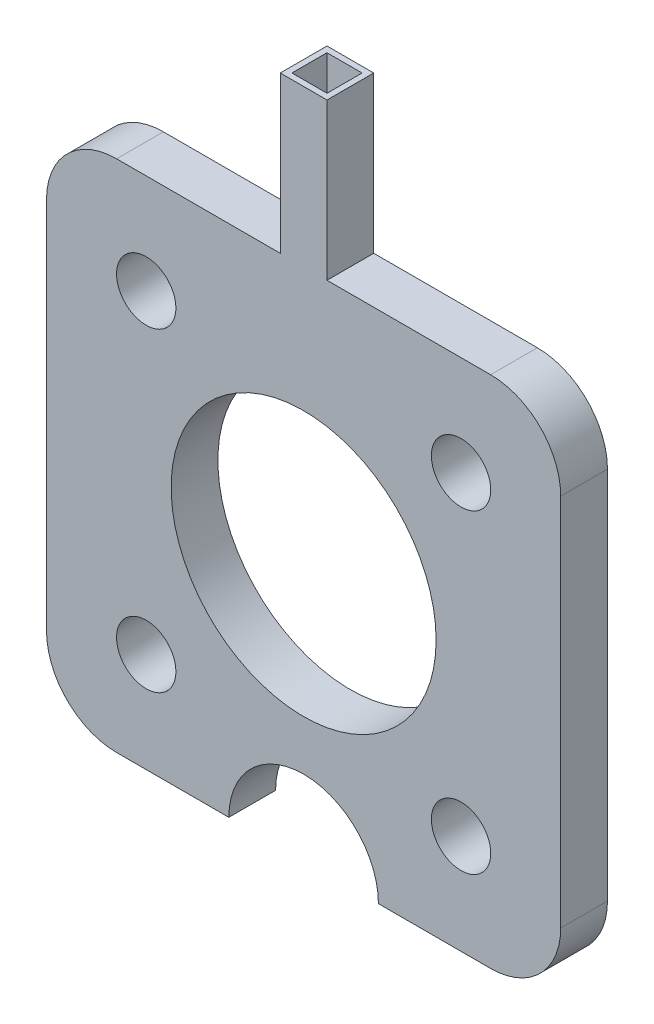
ISO-10303-21;
HEADER;
FILE_DESCRIPTION(('STEP AP214'),'2;1');
FILE_NAME('part.step','',(''),(''),'','','');
FILE_SCHEMA(('AUTOMOTIVE_DESIGN { 1 0 10303 214 1 1 1 1 }'));
ENDSEC;
DATA;
#1=APPLICATION_CONTEXT('core data for automotive mechanical design processes');
#2=APPLICATION_PROTOCOL_DEFINITION('international standard','automotive_design',2000,#1);
#3=PRODUCT_CONTEXT('',#1,'mechanical');
#4=PRODUCT('Part','Part','',(#3));
#5=PRODUCT_RELATED_PRODUCT_CATEGORY('part','',(#4));
#6=PRODUCT_DEFINITION_FORMATION('','',#4);
#7=PRODUCT_DEFINITION_CONTEXT('part definition',#1,'design');
#8=PRODUCT_DEFINITION('design','',#6,#7);
#9=PRODUCT_DEFINITION_SHAPE('','',#8);
#10=(LENGTH_UNIT() NAMED_UNIT(*) SI_UNIT(.MILLI.,.METRE.));
#11=(NAMED_UNIT(*) PLANE_ANGLE_UNIT() SI_UNIT($,.RADIAN.));
#12=(NAMED_UNIT(*) SI_UNIT($,.STERADIAN.) SOLID_ANGLE_UNIT());
#13=UNCERTAINTY_MEASURE_WITH_UNIT(LENGTH_MEASURE(1.E-05),#10,'distance_accuracy_value','');
#14=(GEOMETRIC_REPRESENTATION_CONTEXT(3) GLOBAL_UNCERTAINTY_ASSIGNED_CONTEXT((#13)) GLOBAL_UNIT_ASSIGNED_CONTEXT((#10,
#11,#12)) REPRESENTATION_CONTEXT('',''));
#15=CARTESIAN_POINT('',(0.,0.,0.));
#16=DIRECTION('',(0.,0.,1.));
#17=DIRECTION('',(1.,0.,0.));
#18=AXIS2_PLACEMENT_3D('',#15,#16,#17);
#19=CARTESIAN_POINT('',(0.,0.,2.));
#20=DIRECTION('',(0.,-1.,0.));
#21=DIRECTION('',(0.,0.,-1.));
#22=AXIS2_PLACEMENT_3D('',#19,#20,#21);
#23=PLANE('',#22);
#24=DIRECTION('',(0.,0.,-1.));
#25=VECTOR('',#24,1.);
#26=CARTESIAN_POINT('',(12.,0.,0.));
#27=LINE('',#26,#25);
#28=CARTESIAN_POINT('',(12.,0.,2.));
#29=VERTEX_POINT('',#28);
#30=CARTESIAN_POINT('',(12.,0.,0.));
#31=VERTEX_POINT('',#30);
#32=EDGE_CURVE('E215',#29,#31,#27,.T.);
#33=ORIENTED_EDGE('',*,*,#32,.F.);
#34=DIRECTION('',(-1.,0.,0.));
#35=VECTOR('',#34,1.);
#36=CARTESIAN_POINT('',(0.,0.,2.));
#37=LINE('',#36,#35);
#38=CARTESIAN_POINT('',(19.,0.,2.));
#39=VERTEX_POINT('',#38);
#40=EDGE_CURVE('E321',#39,#29,#37,.T.);
#41=ORIENTED_EDGE('',*,*,#40,.F.);
#42=DIRECTION('',(0.,0.,-1.));
#43=VECTOR('',#42,1.);
#44=CARTESIAN_POINT('',(19.,0.,2.));
#45=LINE('',#44,#43);
#46=CARTESIAN_POINT('',(19.,0.,0.));
#47=VERTEX_POINT('',#46);
#48=EDGE_CURVE('E53',#39,#47,#45,.T.);
#49=ORIENTED_EDGE('',*,*,#48,.T.);
#50=DIRECTION('',(-1.,0.,0.));
#51=VECTOR('',#50,1.);
#52=CARTESIAN_POINT('',(0.,0.,0.));
#53=LINE('',#52,#51);
#54=EDGE_CURVE('E312',#47,#31,#53,.T.);
#55=ORIENTED_EDGE('',*,*,#54,.T.);
#56=EDGE_LOOP('',(#33,#41,#49,#55));
#57=FACE_BOUND('',#56,.T.);
#58=ADVANCED_FACE('F43',(#57),#23,.F.);
#59=DIRECTION('',(0.,0.,1.));
#60=VECTOR('',#59,1.);
#61=CARTESIAN_POINT('',(10.,0.,0.));
#62=LINE('',#61,#60);
#63=CARTESIAN_POINT('',(10.,0.,0.));
#64=VERTEX_POINT('',#63);
#65=CARTESIAN_POINT('',(10.,0.,2.));
#66=VERTEX_POINT('',#65);
#67=EDGE_CURVE('E226',#64,#66,#62,.T.);
#68=ORIENTED_EDGE('',*,*,#67,.F.);
#69=CARTESIAN_POINT('',(3.,0.,0.));
#70=VERTEX_POINT('',#69);
#71=EDGE_CURVE('E338',#64,#70,#53,.T.);
#72=ORIENTED_EDGE('',*,*,#71,.T.);
#73=DIRECTION('',(0.,0.,-1.));
#74=VECTOR('',#73,1.);
#75=CARTESIAN_POINT('',(3.,0.,2.));
#76=LINE('',#75,#74);
#77=CARTESIAN_POINT('',(3.,0.,2.));
#78=VERTEX_POINT('',#77);
#79=EDGE_CURVE('E11',#70,#78,#76,.F.);
#80=ORIENTED_EDGE('',*,*,#79,.T.);
#81=EDGE_CURVE('E67',#66,#78,#37,.T.);
#82=ORIENTED_EDGE('',*,*,#81,.F.);
#83=EDGE_LOOP('',(#68,#72,#80,#82));
#84=FACE_BOUND('',#83,.T.);
#85=ADVANCED_FACE('F447',(#84),#23,.F.);
#86=CARTESIAN_POINT('',(0.,-22.,2.));
#87=DIRECTION('',(0.,1.,0.));
#88=DIRECTION('',(0.,0.,1.));
#89=AXIS2_PLACEMENT_3D('',#86,#87,#88);
#90=PLANE('',#89);
#91=DIRECTION('',(1.,0.,0.));
#92=VECTOR('',#91,1.);
#93=CARTESIAN_POINT('',(0.,-22.,0.));
#94=LINE('',#93,#92);
#95=CARTESIAN_POINT('',(3.,-22.,0.));
#96=VERTEX_POINT('',#95);
#97=CARTESIAN_POINT('',(7.8,-22.,0.));
#98=VERTEX_POINT('',#97);
#99=EDGE_CURVE('E330',#96,#98,#94,.T.);
#100=ORIENTED_EDGE('',*,*,#99,.T.);
#101=DIRECTION('',(0.,0.,1.));
#102=VECTOR('',#101,1.);
#103=CARTESIAN_POINT('',(7.8,-22.,0.));
#104=LINE('',#103,#102);
#105=CARTESIAN_POINT('',(7.8,-22.,2.));
#106=VERTEX_POINT('',#105);
#107=EDGE_CURVE('E264',#98,#106,#104,.T.);
#108=ORIENTED_EDGE('',*,*,#107,.T.);
#109=DIRECTION('',(1.,0.,0.));
#110=VECTOR('',#109,1.);
#111=CARTESIAN_POINT('',(0.,-22.,2.));
#112=LINE('',#111,#110);
#113=CARTESIAN_POINT('',(3.,-22.,2.));
#114=VERTEX_POINT('',#113);
#115=EDGE_CURVE('E313',#114,#106,#112,.T.);
#116=ORIENTED_EDGE('',*,*,#115,.F.);
#117=DIRECTION('',(0.,0.,-1.));
#118=VECTOR('',#117,1.);
#119=CARTESIAN_POINT('',(3.,-22.,2.));
#120=LINE('',#119,#118);
#121=EDGE_CURVE('E361',#114,#96,#120,.T.);
#122=ORIENTED_EDGE('',*,*,#121,.T.);
#123=EDGE_LOOP('',(#100,#108,#116,#122));
#124=FACE_BOUND('',#123,.T.);
#125=ADVANCED_FACE('F452',(#124),#90,.F.);
#126=CARTESIAN_POINT('',(0.,0.,2.));
#127=DIRECTION('',(1.,0.,0.));
#128=DIRECTION('',(0.,1.,0.));
#129=AXIS2_PLACEMENT_3D('',#126,#127,#128);
#130=PLANE('',#129);
#131=DIRECTION('',(0.,-1.,0.));
#132=VECTOR('',#131,1.);
#133=CARTESIAN_POINT('',(0.,0.,0.));
#134=LINE('',#133,#132);
#135=CARTESIAN_POINT('',(0.,-3.,0.));
#136=VERTEX_POINT('',#135);
#137=CARTESIAN_POINT('',(0.,-19.,0.));
#138=VERTEX_POINT('',#137);
#139=EDGE_CURVE('E303',#136,#138,#134,.T.);
#140=ORIENTED_EDGE('',*,*,#139,.T.);
#141=DIRECTION('',(0.,0.,-1.));
#142=VECTOR('',#141,1.);
#143=CARTESIAN_POINT('',(0.,-19.,2.));
#144=LINE('',#143,#142);
#145=CARTESIAN_POINT('',(0.,-19.,2.));
#146=VERTEX_POINT('',#145);
#147=EDGE_CURVE('E385',#138,#146,#144,.F.);
#148=ORIENTED_EDGE('',*,*,#147,.T.);
#149=DIRECTION('',(0.,-1.,0.));
#150=VECTOR('',#149,1.);
#151=CARTESIAN_POINT('',(0.,0.,2.));
#152=LINE('',#151,#150);
#153=CARTESIAN_POINT('',(0.,-3.,2.));
#154=VERTEX_POINT('',#153);
#155=EDGE_CURVE('E307',#154,#146,#152,.T.);
#156=ORIENTED_EDGE('',*,*,#155,.F.);
#157=DIRECTION('',(0.,0.,-1.));
#158=VECTOR('',#157,1.);
#159=CARTESIAN_POINT('',(0.,-3.,2.));
#160=LINE('',#159,#158);
#161=EDGE_CURVE('E381',#154,#136,#160,.T.);
#162=ORIENTED_EDGE('',*,*,#161,.T.);
#163=EDGE_LOOP('',(#140,#148,#156,#162));
#164=FACE_BOUND('',#163,.T.);
#165=ADVANCED_FACE('F460',(#164),#130,.F.);
#166=CARTESIAN_POINT('',(14.2,-22.,2.));
#167=VERTEX_POINT('',#166);
#168=CARTESIAN_POINT('',(19.,-22.,2.));
#169=VERTEX_POINT('',#168);
#170=EDGE_CURVE('E311',#167,#169,#112,.T.);
#171=ORIENTED_EDGE('',*,*,#170,.F.);
#172=DIRECTION('',(0.,0.,1.));
#173=VECTOR('',#172,1.);
#174=CARTESIAN_POINT('',(14.2,-22.,0.));
#175=LINE('',#174,#173);
#176=CARTESIAN_POINT('',(14.2,-22.,0.));
#177=VERTEX_POINT('',#176);
#178=EDGE_CURVE('E268',#177,#167,#175,.T.);
#179=ORIENTED_EDGE('',*,*,#178,.F.);
#180=CARTESIAN_POINT('',(19.,-22.,0.));
#181=VERTEX_POINT('',#180);
#182=EDGE_CURVE('E329',#177,#181,#94,.T.);
#183=ORIENTED_EDGE('',*,*,#182,.T.);
#184=DIRECTION('',(0.,0.,-1.));
#185=VECTOR('',#184,1.);
#186=CARTESIAN_POINT('',(19.,-22.,2.));
#187=LINE('',#186,#185);
#188=EDGE_CURVE('E365',#181,#169,#187,.F.);
#189=ORIENTED_EDGE('',*,*,#188,.T.);
#190=EDGE_LOOP('',(#171,#179,#183,#189));
#191=FACE_BOUND('',#190,.T.);
#192=ADVANCED_FACE('F422',(#191),#90,.F.);
#193=CARTESIAN_POINT('',(22.,0.,2.));
#194=DIRECTION('',(-1.,0.,0.));
#195=DIRECTION('',(0.,-1.,0.));
#196=AXIS2_PLACEMENT_3D('',#193,#194,#195);
#197=PLANE('',#196);
#198=DIRECTION('',(0.,1.,0.));
#199=VECTOR('',#198,1.);
#200=CARTESIAN_POINT('',(22.,0.,2.));
#201=LINE('',#200,#199);
#202=CARTESIAN_POINT('',(22.,-19.,2.));
#203=VERTEX_POINT('',#202);
#204=CARTESIAN_POINT('',(22.,-3.,2.));
#205=VERTEX_POINT('',#204);
#206=EDGE_CURVE('E317',#203,#205,#201,.T.);
#207=ORIENTED_EDGE('',*,*,#206,.F.);
#208=DIRECTION('',(0.,0.,-1.));
#209=VECTOR('',#208,1.);
#210=CARTESIAN_POINT('',(22.,-19.,2.));
#211=LINE('',#210,#209);
#212=CARTESIAN_POINT('',(22.,-19.,0.));
#213=VERTEX_POINT('',#212);
#214=EDGE_CURVE('E343',#203,#213,#211,.T.);
#215=ORIENTED_EDGE('',*,*,#214,.T.);
#216=DIRECTION('',(0.,1.,0.));
#217=VECTOR('',#216,1.);
#218=CARTESIAN_POINT('',(22.,0.,0.));
#219=LINE('',#218,#217);
#220=CARTESIAN_POINT('',(22.,-3.,0.));
#221=VERTEX_POINT('',#220);
#222=EDGE_CURVE('E334',#213,#221,#219,.T.);
#223=ORIENTED_EDGE('',*,*,#222,.T.);
#224=DIRECTION('',(0.,0.,-1.));
#225=VECTOR('',#224,1.);
#226=CARTESIAN_POINT('',(22.,-3.,2.));
#227=LINE('',#226,#225);
#228=EDGE_CURVE('E325',#221,#205,#227,.F.);
#229=ORIENTED_EDGE('',*,*,#228,.T.);
#230=EDGE_LOOP('',(#207,#215,#223,#229));
#231=FACE_BOUND('',#230,.T.);
#232=ADVANCED_FACE('F414',(#231),#197,.F.);
#233=CARTESIAN_POINT('',(0.,0.,2.));
#234=DIRECTION('',(0.,0.,1.));
#235=DIRECTION('',(1.,0.,0.));
#236=AXIS2_PLACEMENT_3D('',#233,#234,#235);
#237=PLANE('',#236);
#238=CARTESIAN_POINT('',(11.,-11.,2.));
#239=DIRECTION('',(0.,0.,1.));
#240=DIRECTION('',(1.,0.,0.));
#241=AXIS2_PLACEMENT_3D('',#238,#239,#240);
#242=CIRCLE('',#241,5.66890012969368);
#243=CARTESIAN_POINT('',(16.6689001296937,-11.,2.));
#244=VERTEX_POINT('',#243);
#245=EDGE_CURVE('E256',#244,#244,#242,.T.);
#246=ORIENTED_EDGE('',*,*,#245,.F.);
#247=EDGE_LOOP('',(#246));
#248=FACE_BOUND('',#247,.T.);
#249=CARTESIAN_POINT('',(11.,-22.,2.));
#250=DIRECTION('',(0.,0.,1.));
#251=DIRECTION('',(-1.,0.,0.));
#252=AXIS2_PLACEMENT_3D('',#249,#250,#251);
#253=CIRCLE('',#252,3.2);
#254=EDGE_CURVE('E265',#167,#106,#253,.T.);
#255=ORIENTED_EDGE('',*,*,#254,.F.);
#256=ORIENTED_EDGE('',*,*,#170,.T.);
#257=CARTESIAN_POINT('',(19.,-19.,2.));
#258=DIRECTION('',(0.,0.,1.));
#259=DIRECTION('',(1.,0.,0.));
#260=AXIS2_PLACEMENT_3D('',#257,#258,#259);
#261=CIRCLE('',#260,3.);
#262=EDGE_CURVE('E378',#169,#203,#261,.T.);
#263=ORIENTED_EDGE('',*,*,#262,.T.);
#264=ORIENTED_EDGE('',*,*,#206,.T.);
#265=CARTESIAN_POINT('',(19.,-3.,2.));
#266=DIRECTION('',(0.,0.,1.));
#267=DIRECTION('',(1.,0.,0.));
#268=AXIS2_PLACEMENT_3D('',#265,#266,#267);
#269=CIRCLE('',#268,3.);
#270=EDGE_CURVE('E369',#205,#39,#269,.T.);
#271=ORIENTED_EDGE('',*,*,#270,.T.);
#272=ORIENTED_EDGE('',*,*,#40,.T.);
#273=DIRECTION('',(0.,-1.,0.));
#274=VECTOR('',#273,1.);
#275=CARTESIAN_POINT('',(12.,6.68,2.));
#276=LINE('',#275,#274);
#277=CARTESIAN_POINT('',(12.,6.68,2.));
#278=VERTEX_POINT('',#277);
#279=EDGE_CURVE('E235',#278,#29,#276,.T.);
#280=ORIENTED_EDGE('',*,*,#279,.F.);
#281=DIRECTION('',(1.,0.,0.));
#282=VECTOR('',#281,1.);
#283=CARTESIAN_POINT('',(10.,6.68,2.));
#284=LINE('',#283,#282);
#285=CARTESIAN_POINT('',(10.,6.68,2.));
#286=VERTEX_POINT('',#285);
#287=EDGE_CURVE('E232',#286,#278,#284,.T.);
#288=ORIENTED_EDGE('',*,*,#287,.F.);
#289=DIRECTION('',(0.,-1.,0.));
#290=VECTOR('',#289,1.);
#291=CARTESIAN_POINT('',(10.,6.68,2.));
#292=LINE('',#291,#290);
#293=EDGE_CURVE('E244',#286,#66,#292,.T.);
#294=ORIENTED_EDGE('',*,*,#293,.T.);
#295=ORIENTED_EDGE('',*,*,#81,.T.);
#296=CARTESIAN_POINT('',(3.,-3.,2.));
#297=DIRECTION('',(0.,0.,1.));
#298=DIRECTION('',(1.,0.,0.));
#299=AXIS2_PLACEMENT_3D('',#296,#297,#298);
#300=CIRCLE('',#299,3.);
#301=EDGE_CURVE('E372',#78,#154,#300,.T.);
#302=ORIENTED_EDGE('',*,*,#301,.T.);
#303=ORIENTED_EDGE('',*,*,#155,.T.);
#304=CARTESIAN_POINT('',(3.,-19.,2.));
#305=DIRECTION('',(0.,0.,1.));
#306=DIRECTION('',(1.,0.,0.));
#307=AXIS2_PLACEMENT_3D('',#304,#305,#306);
#308=CIRCLE('',#307,3.);
#309=EDGE_CURVE('E375',#146,#114,#308,.T.);
#310=ORIENTED_EDGE('',*,*,#309,.T.);
#311=ORIENTED_EDGE('',*,*,#115,.T.);
#312=EDGE_LOOP('',(#255,#256,#263,#264,#271,#272,#280,#288,#294,#295,#302,#303,#310,#311));
#313=FACE_BOUND('',#312,.T.);
#314=CARTESIAN_POINT('',(4.265,-17.735,2.));
#315=DIRECTION('',(0.,0.,1.));
#316=DIRECTION('',(1.,0.,0.));
#317=AXIS2_PLACEMENT_3D('',#314,#315,#316);
#318=CIRCLE('',#317,1.27);
#319=CARTESIAN_POINT('',(5.535,-17.735,2.));
#320=VERTEX_POINT('',#319);
#321=EDGE_CURVE('E283',#320,#320,#318,.T.);
#322=ORIENTED_EDGE('',*,*,#321,.F.);
#323=EDGE_LOOP('',(#322));
#324=FACE_BOUND('',#323,.T.);
#325=CARTESIAN_POINT('',(17.735,-4.265,2.));
#326=DIRECTION('',(0.,0.,1.));
#327=DIRECTION('',(1.,0.,0.));
#328=AXIS2_PLACEMENT_3D('',#325,#326,#327);
#329=CIRCLE('',#328,1.27);
#330=CARTESIAN_POINT('',(19.005,-4.265,2.));
#331=VERTEX_POINT('',#330);
#332=EDGE_CURVE('E292',#331,#331,#329,.T.);
#333=ORIENTED_EDGE('',*,*,#332,.F.);
#334=EDGE_LOOP('',(#333));
#335=FACE_BOUND('',#334,.T.);
#336=CARTESIAN_POINT('',(17.735,-17.735,2.));
#337=DIRECTION('',(0.,0.,1.));
#338=DIRECTION('',(1.,0.,0.));
#339=AXIS2_PLACEMENT_3D('',#336,#337,#338);
#340=CIRCLE('',#339,1.27);
#341=CARTESIAN_POINT('',(19.005,-17.735,2.));
#342=VERTEX_POINT('',#341);
#343=EDGE_CURVE('E275',#342,#342,#340,.T.);
#344=ORIENTED_EDGE('',*,*,#343,.F.);
#345=EDGE_LOOP('',(#344));
#346=FACE_BOUND('',#345,.T.);
#347=CARTESIAN_POINT('',(4.265,-4.265,2.));
#348=DIRECTION('',(0.,0.,1.));
#349=DIRECTION('',(1.,0.,0.));
#350=AXIS2_PLACEMENT_3D('',#347,#348,#349);
#351=CIRCLE('',#350,1.27);
#352=CARTESIAN_POINT('',(5.535,-4.265,2.));
#353=VERTEX_POINT('',#352);
#354=EDGE_CURVE('E287',#353,#353,#351,.T.);
#355=ORIENTED_EDGE('',*,*,#354,.F.);
#356=EDGE_LOOP('',(#355));
#357=FACE_BOUND('',#356,.T.);
#358=ADVANCED_FACE('F408',(#248,#313,#324,#335,#346,#357),#237,.T.);
#359=CARTESIAN_POINT('',(0.,0.,0.));
#360=DIRECTION('',(0.,0.,1.));
#361=DIRECTION('',(1.,0.,0.));
#362=AXIS2_PLACEMENT_3D('',#359,#360,#361);
#363=PLANE('',#362);
#364=CARTESIAN_POINT('',(11.,-11.,0.));
#365=DIRECTION('',(0.,0.,1.));
#366=DIRECTION('',(1.,0.,0.));
#367=AXIS2_PLACEMENT_3D('',#364,#365,#366);
#368=CIRCLE('',#367,5.66890012969368);
#369=CARTESIAN_POINT('',(16.6689001296937,-11.,0.));
#370=VERTEX_POINT('',#369);
#371=EDGE_CURVE('E47',#370,#370,#368,.T.);
#372=ORIENTED_EDGE('',*,*,#371,.T.);
#373=EDGE_LOOP('',(#372));
#374=FACE_BOUND('',#373,.T.);
#375=CARTESIAN_POINT('',(4.265,-17.735,0.));
#376=DIRECTION('',(0.,0.,1.));
#377=DIRECTION('',(1.,0.,0.));
#378=AXIS2_PLACEMENT_3D('',#375,#376,#377);
#379=CIRCLE('',#378,1.27);
#380=CARTESIAN_POINT('',(5.535,-17.735,0.));
#381=VERTEX_POINT('',#380);
#382=EDGE_CURVE('E288',#381,#381,#379,.T.);
#383=ORIENTED_EDGE('',*,*,#382,.T.);
#384=EDGE_LOOP('',(#383));
#385=FACE_BOUND('',#384,.T.);
#386=CARTESIAN_POINT('',(17.735,-4.265,0.));
#387=DIRECTION('',(0.,0.,1.));
#388=DIRECTION('',(1.,0.,0.));
#389=AXIS2_PLACEMENT_3D('',#386,#387,#388);
#390=CIRCLE('',#389,1.27);
#391=CARTESIAN_POINT('',(19.005,-4.265,0.));
#392=VERTEX_POINT('',#391);
#393=EDGE_CURVE('E279',#392,#392,#390,.T.);
#394=ORIENTED_EDGE('',*,*,#393,.T.);
#395=EDGE_LOOP('',(#394));
#396=FACE_BOUND('',#395,.T.);
#397=CARTESIAN_POINT('',(17.735,-17.735,0.));
#398=DIRECTION('',(0.,0.,1.));
#399=DIRECTION('',(1.,0.,0.));
#400=AXIS2_PLACEMENT_3D('',#397,#398,#399);
#401=CIRCLE('',#400,1.27);
#402=CARTESIAN_POINT('',(19.005,-17.735,0.));
#403=VERTEX_POINT('',#402);
#404=EDGE_CURVE('E271',#403,#403,#401,.T.);
#405=ORIENTED_EDGE('',*,*,#404,.T.);
#406=EDGE_LOOP('',(#405));
#407=FACE_BOUND('',#406,.T.);
#408=CARTESIAN_POINT('',(4.265,-4.265,0.));
#409=DIRECTION('',(0.,0.,1.));
#410=DIRECTION('',(1.,0.,0.));
#411=AXIS2_PLACEMENT_3D('',#408,#409,#410);
#412=CIRCLE('',#411,1.27);
#413=CARTESIAN_POINT('',(5.535,-4.265,0.));
#414=VERTEX_POINT('',#413);
#415=EDGE_CURVE('E299',#414,#414,#412,.T.);
#416=ORIENTED_EDGE('',*,*,#415,.T.);
#417=EDGE_LOOP('',(#416));
#418=FACE_BOUND('',#417,.T.);
#419=ORIENTED_EDGE('',*,*,#182,.F.);
#420=CARTESIAN_POINT('',(11.,-22.,0.));
#421=DIRECTION('',(0.,0.,1.));
#422=DIRECTION('',(-1.,0.,0.));
#423=AXIS2_PLACEMENT_3D('',#420,#421,#422);
#424=CIRCLE('',#423,3.2);
#425=EDGE_CURVE('E260',#177,#98,#424,.T.);
#426=ORIENTED_EDGE('',*,*,#425,.T.);
#427=ORIENTED_EDGE('',*,*,#99,.F.);
#428=CARTESIAN_POINT('',(3.,-19.,0.));
#429=DIRECTION('',(0.,0.,1.));
#430=DIRECTION('',(1.,0.,0.));
#431=AXIS2_PLACEMENT_3D('',#428,#429,#430);
#432=CIRCLE('',#431,3.);
#433=EDGE_CURVE('E354',#96,#138,#432,.F.);
#434=ORIENTED_EDGE('',*,*,#433,.T.);
#435=ORIENTED_EDGE('',*,*,#139,.F.);
#436=CARTESIAN_POINT('',(3.,-3.,0.));
#437=DIRECTION('',(0.,0.,1.));
#438=DIRECTION('',(1.,0.,0.));
#439=AXIS2_PLACEMENT_3D('',#436,#437,#438);
#440=CIRCLE('',#439,3.);
#441=EDGE_CURVE('E350',#136,#70,#440,.F.);
#442=ORIENTED_EDGE('',*,*,#441,.T.);
#443=ORIENTED_EDGE('',*,*,#71,.F.);
#444=DIRECTION('',(0.,-1.,0.));
#445=VECTOR('',#444,1.);
#446=CARTESIAN_POINT('',(10.,6.68,0.));
#447=LINE('',#446,#445);
#448=CARTESIAN_POINT('',(10.,6.68,0.));
#449=VERTEX_POINT('',#448);
#450=EDGE_CURVE('E248',#449,#64,#447,.T.);
#451=ORIENTED_EDGE('',*,*,#450,.F.);
#452=DIRECTION('',(-1.,0.,0.));
#453=VECTOR('',#452,1.);
#454=CARTESIAN_POINT('',(10.,6.68,0.));
#455=LINE('',#454,#453);
#456=CARTESIAN_POINT('',(12.,6.68,0.));
#457=VERTEX_POINT('',#456);
#458=EDGE_CURVE('E225',#457,#449,#455,.T.);
#459=ORIENTED_EDGE('',*,*,#458,.F.);
#460=DIRECTION('',(0.,-1.,0.));
#461=VECTOR('',#460,1.);
#462=CARTESIAN_POINT('',(12.,6.68,0.));
#463=LINE('',#462,#461);
#464=EDGE_CURVE('E252',#457,#31,#463,.T.);
#465=ORIENTED_EDGE('',*,*,#464,.T.);
#466=ORIENTED_EDGE('',*,*,#54,.F.);
#467=CARTESIAN_POINT('',(19.,-3.,0.));
#468=DIRECTION('',(0.,0.,1.));
#469=DIRECTION('',(1.,0.,0.));
#470=AXIS2_PLACEMENT_3D('',#467,#468,#469);
#471=CIRCLE('',#470,3.);
#472=EDGE_CURVE('E347',#47,#221,#471,.F.);
#473=ORIENTED_EDGE('',*,*,#472,.T.);
#474=ORIENTED_EDGE('',*,*,#222,.F.);
#475=CARTESIAN_POINT('',(19.,-19.,0.));
#476=DIRECTION('',(0.,0.,1.));
#477=DIRECTION('',(1.,0.,0.));
#478=AXIS2_PLACEMENT_3D('',#475,#476,#477);
#479=CIRCLE('',#478,3.);
#480=EDGE_CURVE('E357',#213,#181,#479,.F.);
#481=ORIENTED_EDGE('',*,*,#480,.T.);
#482=EDGE_LOOP('',(#419,#426,#427,#434,#435,#442,#443,#451,#459,#465,#466,#473,#474,#481));
#483=FACE_BOUND('',#482,.T.);
#484=ADVANCED_FACE('F398',(#374,#385,#396,#407,#418,#483),#363,.F.);
#485=CARTESIAN_POINT('',(19.,-19.,2.));
#486=DIRECTION('',(0.,0.,-1.));
#487=DIRECTION('',(-1.,0.,0.));
#488=AXIS2_PLACEMENT_3D('',#485,#486,#487);
#489=CYLINDRICAL_SURFACE('',#488,3.);
#490=ORIENTED_EDGE('',*,*,#262,.F.);
#491=ORIENTED_EDGE('',*,*,#188,.F.);
#492=ORIENTED_EDGE('',*,*,#480,.F.);
#493=ORIENTED_EDGE('',*,*,#214,.F.);
#494=EDGE_LOOP('',(#490,#491,#492,#493));
#495=FACE_BOUND('',#494,.T.);
#496=ADVANCED_FACE('F419',(#495),#489,.T.);
#497=CARTESIAN_POINT('',(3.,-19.,2.));
#498=DIRECTION('',(0.,0.,-1.));
#499=DIRECTION('',(-1.,0.,0.));
#500=AXIS2_PLACEMENT_3D('',#497,#498,#499);
#501=CYLINDRICAL_SURFACE('',#500,3.);
#502=ORIENTED_EDGE('',*,*,#309,.F.);
#503=ORIENTED_EDGE('',*,*,#147,.F.);
#504=ORIENTED_EDGE('',*,*,#433,.F.);
#505=ORIENTED_EDGE('',*,*,#121,.F.);
#506=EDGE_LOOP('',(#502,#503,#504,#505));
#507=FACE_BOUND('',#506,.T.);
#508=ADVANCED_FACE('F466',(#507),#501,.T.);
#509=CARTESIAN_POINT('',(3.,-3.,2.));
#510=DIRECTION('',(0.,0.,-1.));
#511=DIRECTION('',(-1.,0.,0.));
#512=AXIS2_PLACEMENT_3D('',#509,#510,#511);
#513=CYLINDRICAL_SURFACE('',#512,3.);
#514=ORIENTED_EDGE('',*,*,#301,.F.);
#515=ORIENTED_EDGE('',*,*,#79,.F.);
#516=ORIENTED_EDGE('',*,*,#441,.F.);
#517=ORIENTED_EDGE('',*,*,#161,.F.);
#518=EDGE_LOOP('',(#514,#515,#516,#517));
#519=FACE_BOUND('',#518,.T.);
#520=ADVANCED_FACE('F468',(#519),#513,.T.);
#521=CARTESIAN_POINT('',(19.,-3.,2.));
#522=DIRECTION('',(0.,0.,-1.));
#523=DIRECTION('',(-1.,0.,0.));
#524=AXIS2_PLACEMENT_3D('',#521,#522,#523);
#525=CYLINDRICAL_SURFACE('',#524,3.);
#526=ORIENTED_EDGE('',*,*,#270,.F.);
#527=ORIENTED_EDGE('',*,*,#228,.F.);
#528=ORIENTED_EDGE('',*,*,#472,.F.);
#529=ORIENTED_EDGE('',*,*,#48,.F.);
#530=EDGE_LOOP('',(#526,#527,#528,#529));
#531=FACE_BOUND('',#530,.T.);
#532=ADVANCED_FACE('F45',(#531),#525,.T.);
#533=CARTESIAN_POINT('',(4.265,-4.265,0.));
#534=DIRECTION('',(0.,0.,1.));
#535=DIRECTION('',(1.,0.,0.));
#536=AXIS2_PLACEMENT_3D('',#533,#534,#535);
#537=CYLINDRICAL_SURFACE('',#536,1.27);
#538=ORIENTED_EDGE('',*,*,#415,.F.);
#539=EDGE_LOOP('',(#538));
#540=FACE_BOUND('',#539,.T.);
#541=ORIENTED_EDGE('',*,*,#354,.T.);
#542=EDGE_LOOP('',(#541));
#543=FACE_BOUND('',#542,.T.);
#544=ADVANCED_FACE('F475',(#540,#543),#537,.F.);
#545=CARTESIAN_POINT('',(17.735,-17.735,0.));
#546=DIRECTION('',(0.,0.,1.));
#547=DIRECTION('',(1.,0.,0.));
#548=AXIS2_PLACEMENT_3D('',#545,#546,#547);
#549=CYLINDRICAL_SURFACE('',#548,1.27);
#550=ORIENTED_EDGE('',*,*,#404,.F.);
#551=EDGE_LOOP('',(#550));
#552=FACE_BOUND('',#551,.T.);
#553=ORIENTED_EDGE('',*,*,#343,.T.);
#554=EDGE_LOOP('',(#553));
#555=FACE_BOUND('',#554,.T.);
#556=ADVANCED_FACE('F641',(#552,#555),#549,.F.);
#557=CARTESIAN_POINT('',(17.735,-4.265,0.));
#558=DIRECTION('',(0.,0.,1.));
#559=DIRECTION('',(1.,0.,0.));
#560=AXIS2_PLACEMENT_3D('',#557,#558,#559);
#561=CYLINDRICAL_SURFACE('',#560,1.27);
#562=ORIENTED_EDGE('',*,*,#393,.F.);
#563=EDGE_LOOP('',(#562));
#564=FACE_BOUND('',#563,.T.);
#565=ORIENTED_EDGE('',*,*,#332,.T.);
#566=EDGE_LOOP('',(#565));
#567=FACE_BOUND('',#566,.T.);
#568=ADVANCED_FACE('F632',(#564,#567),#561,.F.);
#569=CARTESIAN_POINT('',(4.265,-17.735,0.));
#570=DIRECTION('',(0.,0.,1.));
#571=DIRECTION('',(1.,0.,0.));
#572=AXIS2_PLACEMENT_3D('',#569,#570,#571);
#573=CYLINDRICAL_SURFACE('',#572,1.27);
#574=ORIENTED_EDGE('',*,*,#382,.F.);
#575=EDGE_LOOP('',(#574));
#576=FACE_BOUND('',#575,.T.);
#577=ORIENTED_EDGE('',*,*,#321,.T.);
#578=EDGE_LOOP('',(#577));
#579=FACE_BOUND('',#578,.T.);
#580=ADVANCED_FACE('F443',(#576,#579),#573,.F.);
#581=CARTESIAN_POINT('',(11.,-22.,0.));
#582=DIRECTION('',(0.,0.,1.));
#583=DIRECTION('',(1.,0.,0.));
#584=AXIS2_PLACEMENT_3D('',#581,#582,#583);
#585=CYLINDRICAL_SURFACE('',#584,3.2);
#586=ORIENTED_EDGE('',*,*,#254,.T.);
#587=ORIENTED_EDGE('',*,*,#107,.F.);
#588=ORIENTED_EDGE('',*,*,#425,.F.);
#589=ORIENTED_EDGE('',*,*,#178,.T.);
#590=EDGE_LOOP('',(#586,#587,#588,#589));
#591=FACE_BOUND('',#590,.T.);
#592=ADVANCED_FACE('F433',(#591),#585,.F.);
#593=CARTESIAN_POINT('',(11.,-11.,-8.));
#594=DIRECTION('',(0.,0.,1.));
#595=DIRECTION('',(1.,0.,0.));
#596=AXIS2_PLACEMENT_3D('',#593,#594,#595);
#597=CYLINDRICAL_SURFACE('',#596,5.66890012969368);
#598=ORIENTED_EDGE('',*,*,#245,.T.);
#599=EDGE_LOOP('',(#598));
#600=FACE_BOUND('',#599,.T.);
#601=ORIENTED_EDGE('',*,*,#371,.F.);
#602=EDGE_LOOP('',(#601));
#603=FACE_BOUND('',#602,.T.);
#604=ADVANCED_FACE('F431',(#600,#603),#597,.F.);
#605=CARTESIAN_POINT('',(12.,6.68,0.));
#606=DIRECTION('',(-1.,0.,0.));
#607=DIRECTION('',(0.,0.,1.));
#608=AXIS2_PLACEMENT_3D('',#605,#606,#607);
#609=PLANE('',#608);
#610=ORIENTED_EDGE('',*,*,#32,.T.);
#611=ORIENTED_EDGE('',*,*,#464,.F.);
#612=DIRECTION('',(0.,0.,-1.));
#613=VECTOR('',#612,1.);
#614=CARTESIAN_POINT('',(12.,6.68,0.));
#615=LINE('',#614,#613);
#616=EDGE_CURVE('E221',#278,#457,#615,.T.);
#617=ORIENTED_EDGE('',*,*,#616,.F.);
#618=ORIENTED_EDGE('',*,*,#279,.T.);
#619=EDGE_LOOP('',(#610,#611,#617,#618));
#620=FACE_BOUND('',#619,.T.);
#621=ADVANCED_FACE('F404',(#620),#609,.F.);
#622=CARTESIAN_POINT('',(10.,6.68,0.));
#623=DIRECTION('',(1.,0.,0.));
#624=DIRECTION('',(0.,0.,-1.));
#625=AXIS2_PLACEMENT_3D('',#622,#623,#624);
#626=PLANE('',#625);
#627=ORIENTED_EDGE('',*,*,#67,.T.);
#628=ORIENTED_EDGE('',*,*,#293,.F.);
#629=DIRECTION('',(0.,0.,1.));
#630=VECTOR('',#629,1.);
#631=CARTESIAN_POINT('',(10.,6.68,0.));
#632=LINE('',#631,#630);
#633=EDGE_CURVE('E229',#449,#286,#632,.T.);
#634=ORIENTED_EDGE('',*,*,#633,.F.);
#635=ORIENTED_EDGE('',*,*,#450,.T.);
#636=EDGE_LOOP('',(#627,#628,#634,#635));
#637=FACE_BOUND('',#636,.T.);
#638=ADVANCED_FACE('F441',(#637),#626,.F.);
#639=CARTESIAN_POINT('',(0.,6.68,0.));
#640=DIRECTION('',(0.,1.,0.));
#641=DIRECTION('',(0.,0.,1.));
#642=AXIS2_PLACEMENT_3D('',#639,#640,#641);
#643=PLANE('',#642);
#644=DIRECTION('',(0.,0.,-1.));
#645=VECTOR('',#644,1.);
#646=CARTESIAN_POINT('',(11.7512773412887,6.68,0.25));
#647=LINE('',#646,#645);
#648=CARTESIAN_POINT('',(11.7512773412887,6.68,1.75));
#649=VERTEX_POINT('',#648);
#650=CARTESIAN_POINT('',(11.7512773412887,6.68,0.25));
#651=VERTEX_POINT('',#650);
#652=EDGE_CURVE('E60',#649,#651,#647,.T.);
#653=ORIENTED_EDGE('',*,*,#652,.F.);
#654=DIRECTION('',(1.,0.,0.));
#655=VECTOR('',#654,1.);
#656=CARTESIAN_POINT('',(10.2487226587113,6.68,1.75));
#657=LINE('',#656,#655);
#658=CARTESIAN_POINT('',(10.2487226587113,6.68,1.75));
#659=VERTEX_POINT('',#658);
#660=EDGE_CURVE('E193',#659,#649,#657,.T.);
#661=ORIENTED_EDGE('',*,*,#660,.F.);
#662=DIRECTION('',(0.,0.,1.));
#663=VECTOR('',#662,1.);
#664=CARTESIAN_POINT('',(10.2487226587113,6.68,0.25));
#665=LINE('',#664,#663);
#666=CARTESIAN_POINT('',(10.2487226587113,6.68,0.25));
#667=VERTEX_POINT('',#666);
#668=EDGE_CURVE('E197',#667,#659,#665,.T.);
#669=ORIENTED_EDGE('',*,*,#668,.F.);
#670=DIRECTION('',(-1.,0.,0.));
#671=VECTOR('',#670,1.);
#672=CARTESIAN_POINT('',(10.2487226587113,6.68,0.25));
#673=LINE('',#672,#671);
#674=EDGE_CURVE('E206',#651,#667,#673,.T.);
#675=ORIENTED_EDGE('',*,*,#674,.F.);
#676=EDGE_LOOP('',(#653,#661,#669,#675));
#677=FACE_BOUND('',#676,.T.);
#678=ORIENTED_EDGE('',*,*,#616,.T.);
#679=ORIENTED_EDGE('',*,*,#458,.T.);
#680=ORIENTED_EDGE('',*,*,#633,.T.);
#681=ORIENTED_EDGE('',*,*,#287,.T.);
#682=EDGE_LOOP('',(#678,#679,#680,#681));
#683=FACE_BOUND('',#682,.T.);
#684=ADVANCED_FACE('F492',(#677,#683),#643,.T.);
#685=CARTESIAN_POINT('',(11.7512773412887,-0.12,0.25));
#686=DIRECTION('',(1.,0.,0.));
#687=DIRECTION('',(0.,0.,-1.));
#688=AXIS2_PLACEMENT_3D('',#685,#686,#687);
#689=PLANE('',#688);
#690=ORIENTED_EDGE('',*,*,#652,.T.);
#691=DIRECTION('',(0.,1.,0.));
#692=VECTOR('',#691,1.);
#693=CARTESIAN_POINT('',(11.7512773412887,-0.12,0.25));
#694=LINE('',#693,#692);
#695=CARTESIAN_POINT('',(11.7512773412887,-0.12,0.25));
#696=VERTEX_POINT('',#695);
#697=EDGE_CURVE('E168',#696,#651,#694,.T.);
#698=ORIENTED_EDGE('',*,*,#697,.F.);
#699=DIRECTION('',(0.,0.,-1.));
#700=VECTOR('',#699,1.);
#701=CARTESIAN_POINT('',(11.7512773412887,-0.12,0.25));
#702=LINE('',#701,#700);
#703=CARTESIAN_POINT('',(11.7512773412887,-0.12,1.75));
#704=VERTEX_POINT('',#703);
#705=EDGE_CURVE('E172',#704,#696,#702,.T.);
#706=ORIENTED_EDGE('',*,*,#705,.F.);
#707=DIRECTION('',(0.,1.,0.));
#708=VECTOR('',#707,1.);
#709=CARTESIAN_POINT('',(11.7512773412887,-0.12,1.75));
#710=LINE('',#709,#708);
#711=EDGE_CURVE('E212',#704,#649,#710,.T.);
#712=ORIENTED_EDGE('',*,*,#711,.T.);
#713=EDGE_LOOP('',(#690,#698,#706,#712));
#714=FACE_BOUND('',#713,.T.);
#715=ADVANCED_FACE('F170',(#714),#689,.F.);
#716=CARTESIAN_POINT('',(10.2487226587113,-0.12,1.75));
#717=DIRECTION('',(0.,0.,1.));
#718=DIRECTION('',(1.,0.,0.));
#719=AXIS2_PLACEMENT_3D('',#716,#717,#718);
#720=PLANE('',#719);
#721=ORIENTED_EDGE('',*,*,#660,.T.);
#722=ORIENTED_EDGE('',*,*,#711,.F.);
#723=DIRECTION('',(1.,0.,0.));
#724=VECTOR('',#723,1.);
#725=CARTESIAN_POINT('',(10.2487226587113,-0.12,1.75));
#726=LINE('',#725,#724);
#727=CARTESIAN_POINT('',(10.2487226587113,-0.12,1.75));
#728=VERTEX_POINT('',#727);
#729=EDGE_CURVE('E179',#728,#704,#726,.T.);
#730=ORIENTED_EDGE('',*,*,#729,.F.);
#731=DIRECTION('',(0.,1.,0.));
#732=VECTOR('',#731,1.);
#733=CARTESIAN_POINT('',(10.2487226587113,-0.12,1.75));
#734=LINE('',#733,#732);
#735=EDGE_CURVE('E216',#728,#659,#734,.T.);
#736=ORIENTED_EDGE('',*,*,#735,.T.);
#737=EDGE_LOOP('',(#721,#722,#730,#736));
#738=FACE_BOUND('',#737,.T.);
#739=ADVANCED_FACE('F500',(#738),#720,.F.);
#740=CARTESIAN_POINT('',(10.2487226587113,-0.12,0.25));
#741=DIRECTION('',(-1.,0.,0.));
#742=DIRECTION('',(0.,0.,1.));
#743=AXIS2_PLACEMENT_3D('',#740,#741,#742);
#744=PLANE('',#743);
#745=ORIENTED_EDGE('',*,*,#668,.T.);
#746=ORIENTED_EDGE('',*,*,#735,.F.);
#747=DIRECTION('',(0.,0.,1.));
#748=VECTOR('',#747,1.);
#749=CARTESIAN_POINT('',(10.2487226587113,-0.12,0.25));
#750=LINE('',#749,#748);
#751=CARTESIAN_POINT('',(10.2487226587113,-0.12,0.25));
#752=VERTEX_POINT('',#751);
#753=EDGE_CURVE('E188',#752,#728,#750,.T.);
#754=ORIENTED_EDGE('',*,*,#753,.F.);
#755=DIRECTION('',(0.,1.,0.));
#756=VECTOR('',#755,1.);
#757=CARTESIAN_POINT('',(10.2487226587113,-0.12,0.25));
#758=LINE('',#757,#756);
#759=EDGE_CURVE('E178',#752,#667,#758,.T.);
#760=ORIENTED_EDGE('',*,*,#759,.T.);
#761=EDGE_LOOP('',(#745,#746,#754,#760));
#762=FACE_BOUND('',#761,.T.);
#763=ADVANCED_FACE('F506',(#762),#744,.F.);
#764=CARTESIAN_POINT('',(10.2487226587113,-0.12,0.25));
#765=DIRECTION('',(0.,0.,-1.));
#766=DIRECTION('',(-1.,0.,0.));
#767=AXIS2_PLACEMENT_3D('',#764,#765,#766);
#768=PLANE('',#767);
#769=ORIENTED_EDGE('',*,*,#674,.T.);
#770=ORIENTED_EDGE('',*,*,#759,.F.);
#771=DIRECTION('',(-1.,0.,0.));
#772=VECTOR('',#771,1.);
#773=CARTESIAN_POINT('',(10.2487226587113,-0.12,0.25));
#774=LINE('',#773,#772);
#775=EDGE_CURVE('E182',#696,#752,#774,.T.);
#776=ORIENTED_EDGE('',*,*,#775,.F.);
#777=ORIENTED_EDGE('',*,*,#697,.T.);
#778=EDGE_LOOP('',(#769,#770,#776,#777));
#779=FACE_BOUND('',#778,.T.);
#780=ADVANCED_FACE('F183',(#779),#768,.F.);
#781=CARTESIAN_POINT('',(0.,-0.12,0.));
#782=DIRECTION('',(0.,1.,0.));
#783=DIRECTION('',(0.,0.,1.));
#784=AXIS2_PLACEMENT_3D('',#781,#782,#783);
#785=PLANE('',#784);
#786=ORIENTED_EDGE('',*,*,#705,.T.);
#787=ORIENTED_EDGE('',*,*,#775,.T.);
#788=ORIENTED_EDGE('',*,*,#753,.T.);
#789=ORIENTED_EDGE('',*,*,#729,.T.);
#790=EDGE_LOOP('',(#786,#787,#788,#789));
#791=FACE_BOUND('',#790,.T.);
#792=ADVANCED_FACE('F190',(#791),#785,.T.);
#793=CLOSED_SHELL('',(#58,#85,#125,#165,#192,#232,#358,#484,#496,#508,#520,#532,#544,#556,#568,
#580,#592,#604,#621,#638,#684,#715,#739,#763,#780,#792));
#794=MANIFOLD_SOLID_BREP('B2',#793);
#795=ADVANCED_BREP_SHAPE_REPRESENTATION('',(#18,#794),#14);
#796=SHAPE_DEFINITION_REPRESENTATION(#9,#795);
ENDSEC;
END-ISO-10303-21;
